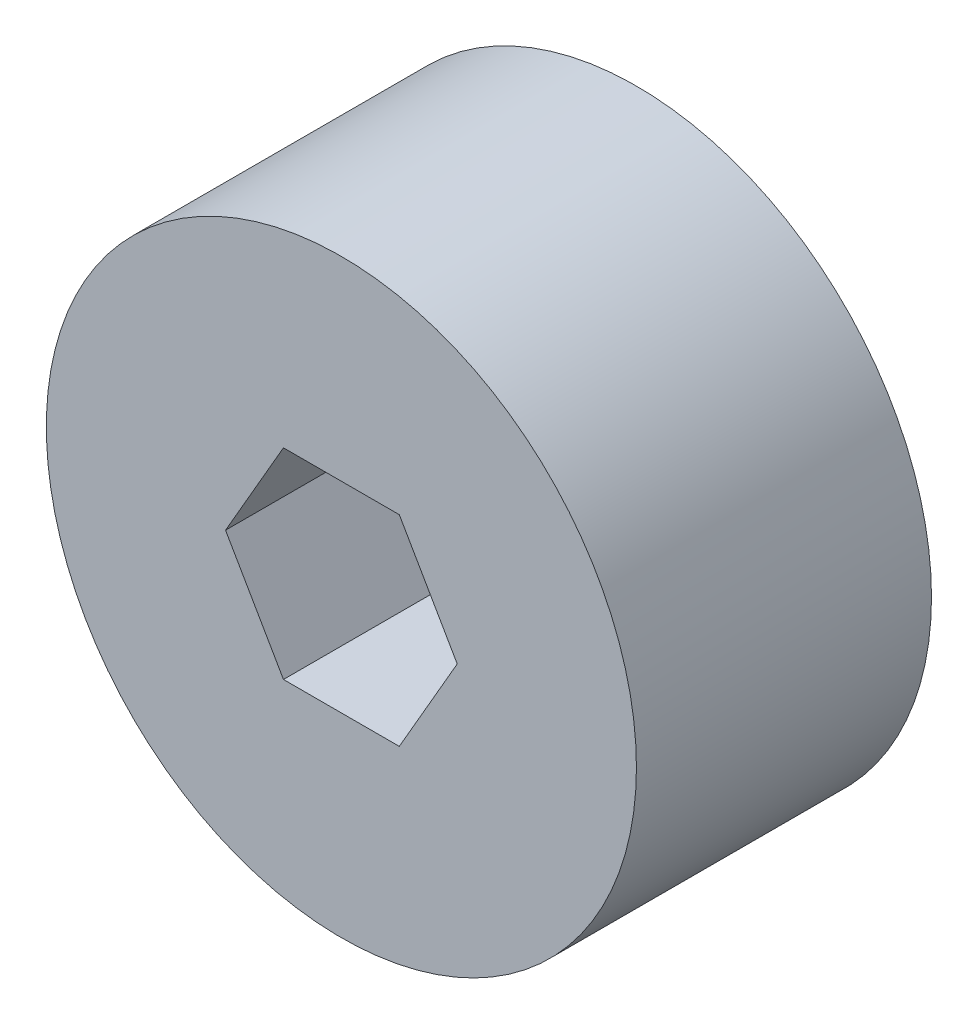
ISO-10303-21;
HEADER;
FILE_DESCRIPTION(('STEP AP214'),'2;1');
FILE_NAME('part.step','',(''),(''),'','','');
FILE_SCHEMA(('AUTOMOTIVE_DESIGN { 1 0 10303 214 1 1 1 1 }'));
ENDSEC;
DATA;
#1=APPLICATION_CONTEXT('core data for automotive mechanical design processes');
#2=APPLICATION_PROTOCOL_DEFINITION('international standard','automotive_design',2000,#1);
#3=PRODUCT_CONTEXT('',#1,'mechanical');
#4=PRODUCT('Part','Part','',(#3));
#5=PRODUCT_RELATED_PRODUCT_CATEGORY('part','',(#4));
#6=PRODUCT_DEFINITION_FORMATION('','',#4);
#7=PRODUCT_DEFINITION_CONTEXT('part definition',#1,'design');
#8=PRODUCT_DEFINITION('design','',#6,#7);
#9=PRODUCT_DEFINITION_SHAPE('','',#8);
#10=(LENGTH_UNIT() NAMED_UNIT(*) SI_UNIT(.MILLI.,.METRE.));
#11=(NAMED_UNIT(*) PLANE_ANGLE_UNIT() SI_UNIT($,.RADIAN.));
#12=(NAMED_UNIT(*) SI_UNIT($,.STERADIAN.) SOLID_ANGLE_UNIT());
#13=UNCERTAINTY_MEASURE_WITH_UNIT(LENGTH_MEASURE(1.E-05),#10,'distance_accuracy_value','');
#14=(GEOMETRIC_REPRESENTATION_CONTEXT(3) GLOBAL_UNCERTAINTY_ASSIGNED_CONTEXT((#13)) GLOBAL_UNIT_ASSIGNED_CONTEXT((#10,
#11,#12)) REPRESENTATION_CONTEXT('',''));
#15=CARTESIAN_POINT('',(0.,0.,0.));
#16=DIRECTION('',(0.,0.,1.));
#17=DIRECTION('',(1.,0.,0.));
#18=AXIS2_PLACEMENT_3D('',#15,#16,#17);
#19=CARTESIAN_POINT('',(0.,0.,12.7));
#20=DIRECTION('',(0.,0.,-1.));
#21=DIRECTION('',(-1.,0.,0.));
#22=AXIS2_PLACEMENT_3D('',#19,#20,#21);
#23=CYLINDRICAL_SURFACE('',#22,12.7);
#24=CARTESIAN_POINT('',(0.,0.,12.7));
#25=DIRECTION('',(0.,0.,1.));
#26=DIRECTION('',(1.,0.,0.));
#27=AXIS2_PLACEMENT_3D('',#24,#25,#26);
#28=CIRCLE('',#27,12.7);
#29=CARTESIAN_POINT('',(12.7,0.,12.7));
#30=VERTEX_POINT('',#29);
#31=EDGE_CURVE('E11',#30,#30,#28,.T.);
#32=ORIENTED_EDGE('',*,*,#31,.F.);
#33=EDGE_LOOP('',(#32));
#34=FACE_BOUND('',#33,.T.);
#35=CARTESIAN_POINT('',(0.,0.,0.));
#36=DIRECTION('',(0.,0.,1.));
#37=DIRECTION('',(1.,0.,0.));
#38=AXIS2_PLACEMENT_3D('',#35,#36,#37);
#39=CIRCLE('',#38,12.7);
#40=CARTESIAN_POINT('',(12.7,0.,0.));
#41=VERTEX_POINT('',#40);
#42=EDGE_CURVE('E48',#41,#41,#39,.T.);
#43=ORIENTED_EDGE('',*,*,#42,.T.);
#44=EDGE_LOOP('',(#43));
#45=FACE_BOUND('',#44,.T.);
#46=ADVANCED_FACE('F45',(#34,#45),#23,.T.);
#47=CARTESIAN_POINT('',(0.,0.,12.7));
#48=DIRECTION('',(0.,0.,1.));
#49=DIRECTION('',(1.,0.,0.));
#50=AXIS2_PLACEMENT_3D('',#47,#48,#49);
#51=PLANE('',#50);
#52=DIRECTION('',(0.5,-0.866025403784438,0.));
#53=VECTOR('',#52,1.);
#54=CARTESIAN_POINT('',(-4.98599692472161,0.,12.7));
#55=LINE('',#54,#53);
#56=CARTESIAN_POINT('',(-4.98599692472161,0.,12.7));
#57=VERTEX_POINT('',#56);
#58=CARTESIAN_POINT('',(-2.4929984623608,-4.318,12.7));
#59=VERTEX_POINT('',#58);
#60=EDGE_CURVE('E60',#57,#59,#55,.T.);
#61=ORIENTED_EDGE('',*,*,#60,.F.);
#62=DIRECTION('',(-0.5,-0.866025403784439,0.));
#63=VECTOR('',#62,1.);
#64=CARTESIAN_POINT('',(-2.4929984623608,4.318,12.7));
#65=LINE('',#64,#63);
#66=CARTESIAN_POINT('',(-2.4929984623608,4.318,12.7));
#67=VERTEX_POINT('',#66);
#68=EDGE_CURVE('E120',#67,#57,#65,.T.);
#69=ORIENTED_EDGE('',*,*,#68,.F.);
#70=DIRECTION('',(-1.,0.,0.));
#71=VECTOR('',#70,1.);
#72=CARTESIAN_POINT('',(2.4929984623608,4.318,12.7));
#73=LINE('',#72,#71);
#74=CARTESIAN_POINT('',(2.4929984623608,4.318,12.7));
#75=VERTEX_POINT('',#74);
#76=EDGE_CURVE('E124',#75,#67,#73,.T.);
#77=ORIENTED_EDGE('',*,*,#76,.F.);
#78=DIRECTION('',(-0.5,0.866025403784439,0.));
#79=VECTOR('',#78,1.);
#80=CARTESIAN_POINT('',(4.98599692472161,0.,12.7));
#81=LINE('',#80,#79);
#82=CARTESIAN_POINT('',(4.98599692472161,0.,12.7));
#83=VERTEX_POINT('',#82);
#84=EDGE_CURVE('E147',#83,#75,#81,.T.);
#85=ORIENTED_EDGE('',*,*,#84,.F.);
#86=DIRECTION('',(0.5,0.866025403784438,0.));
#87=VECTOR('',#86,1.);
#88=CARTESIAN_POINT('',(2.4929984623608,-4.318,12.7));
#89=LINE('',#88,#87);
#90=CARTESIAN_POINT('',(2.4929984623608,-4.318,12.7));
#91=VERTEX_POINT('',#90);
#92=EDGE_CURVE('E143',#91,#83,#89,.T.);
#93=ORIENTED_EDGE('',*,*,#92,.F.);
#94=DIRECTION('',(1.,0.,0.));
#95=VECTOR('',#94,1.);
#96=CARTESIAN_POINT('',(-2.4929984623608,-4.318,12.7));
#97=LINE('',#96,#95);
#98=EDGE_CURVE('E140',#59,#91,#97,.T.);
#99=ORIENTED_EDGE('',*,*,#98,.F.);
#100=EDGE_LOOP('',(#61,#69,#77,#85,#93,#99));
#101=FACE_BOUND('',#100,.T.);
#102=ORIENTED_EDGE('',*,*,#31,.T.);
#103=EDGE_LOOP('',(#102));
#104=FACE_BOUND('',#103,.T.);
#105=ADVANCED_FACE('F171',(#101,#104),#51,.T.);
#106=CARTESIAN_POINT('',(0.,0.,0.));
#107=DIRECTION('',(0.,0.,1.));
#108=DIRECTION('',(1.,0.,0.));
#109=AXIS2_PLACEMENT_3D('',#106,#107,#108);
#110=PLANE('',#109);
#111=DIRECTION('',(-0.5,-0.866025403784439,0.));
#112=VECTOR('',#111,1.);
#113=CARTESIAN_POINT('',(-2.4929984623608,4.318,0.));
#114=LINE('',#113,#112);
#115=CARTESIAN_POINT('',(-2.4929984623608,4.318,0.));
#116=VERTEX_POINT('',#115);
#117=CARTESIAN_POINT('',(-4.98599692472161,0.,0.));
#118=VERTEX_POINT('',#117);
#119=EDGE_CURVE('E107',#116,#118,#114,.T.);
#120=ORIENTED_EDGE('',*,*,#119,.T.);
#121=DIRECTION('',(0.5,-0.866025403784438,0.));
#122=VECTOR('',#121,1.);
#123=CARTESIAN_POINT('',(-4.98599692472161,0.,0.));
#124=LINE('',#123,#122);
#125=CARTESIAN_POINT('',(-2.4929984623608,-4.318,0.));
#126=VERTEX_POINT('',#125);
#127=EDGE_CURVE('E100',#118,#126,#124,.T.);
#128=ORIENTED_EDGE('',*,*,#127,.T.);
#129=DIRECTION('',(1.,0.,0.));
#130=VECTOR('',#129,1.);
#131=CARTESIAN_POINT('',(-2.4929984623608,-4.318,0.));
#132=LINE('',#131,#130);
#133=CARTESIAN_POINT('',(2.4929984623608,-4.318,0.));
#134=VERTEX_POINT('',#133);
#135=EDGE_CURVE('E110',#126,#134,#132,.T.);
#136=ORIENTED_EDGE('',*,*,#135,.T.);
#137=DIRECTION('',(0.5,0.866025403784438,0.));
#138=VECTOR('',#137,1.);
#139=CARTESIAN_POINT('',(2.4929984623608,-4.318,0.));
#140=LINE('',#139,#138);
#141=CARTESIAN_POINT('',(4.98599692472161,0.,0.));
#142=VERTEX_POINT('',#141);
#143=EDGE_CURVE('E68',#134,#142,#140,.T.);
#144=ORIENTED_EDGE('',*,*,#143,.T.);
#145=DIRECTION('',(-0.5,0.866025403784439,0.));
#146=VECTOR('',#145,1.);
#147=CARTESIAN_POINT('',(4.98599692472161,0.,0.));
#148=LINE('',#147,#146);
#149=CARTESIAN_POINT('',(2.4929984623608,4.318,0.));
#150=VERTEX_POINT('',#149);
#151=EDGE_CURVE('E129',#142,#150,#148,.T.);
#152=ORIENTED_EDGE('',*,*,#151,.T.);
#153=DIRECTION('',(-1.,0.,0.));
#154=VECTOR('',#153,1.);
#155=CARTESIAN_POINT('',(2.4929984623608,4.318,0.));
#156=LINE('',#155,#154);
#157=EDGE_CURVE('E133',#150,#116,#156,.T.);
#158=ORIENTED_EDGE('',*,*,#157,.T.);
#159=EDGE_LOOP('',(#120,#128,#136,#144,#152,#158));
#160=FACE_BOUND('',#159,.T.);
#161=ORIENTED_EDGE('',*,*,#42,.F.);
#162=EDGE_LOOP('',(#161));
#163=FACE_BOUND('',#162,.T.);
#164=ADVANCED_FACE('F115',(#160,#163),#110,.F.);
#165=CARTESIAN_POINT('',(-4.98599692472161,0.,0.));
#166=DIRECTION('',(-0.866025403784438,-0.5,0.));
#167=DIRECTION('',(0.5,-0.866025403784438,0.));
#168=AXIS2_PLACEMENT_3D('',#165,#166,#167);
#169=PLANE('',#168);
#170=ORIENTED_EDGE('',*,*,#60,.T.);
#171=DIRECTION('',(0.,0.,1.));
#172=VECTOR('',#171,1.);
#173=CARTESIAN_POINT('',(-2.4929984623608,-4.318,0.));
#174=LINE('',#173,#172);
#175=EDGE_CURVE('E96',#126,#59,#174,.T.);
#176=ORIENTED_EDGE('',*,*,#175,.F.);
#177=ORIENTED_EDGE('',*,*,#127,.F.);
#178=DIRECTION('',(0.,0.,1.));
#179=VECTOR('',#178,1.);
#180=CARTESIAN_POINT('',(-4.98599692472161,0.,0.));
#181=LINE('',#180,#179);
#182=EDGE_CURVE('E154',#118,#57,#181,.T.);
#183=ORIENTED_EDGE('',*,*,#182,.T.);
#184=EDGE_LOOP('',(#170,#176,#177,#183));
#185=FACE_BOUND('',#184,.T.);
#186=ADVANCED_FACE('F98',(#185),#169,.F.);
#187=CARTESIAN_POINT('',(-2.4929984623608,4.318,0.));
#188=DIRECTION('',(-0.866025403784439,0.5,0.));
#189=DIRECTION('',(-0.5,-0.866025403784439,0.));
#190=AXIS2_PLACEMENT_3D('',#187,#188,#189);
#191=PLANE('',#190);
#192=ORIENTED_EDGE('',*,*,#68,.T.);
#193=ORIENTED_EDGE('',*,*,#182,.F.);
#194=ORIENTED_EDGE('',*,*,#119,.F.);
#195=DIRECTION('',(0.,0.,1.));
#196=VECTOR('',#195,1.);
#197=CARTESIAN_POINT('',(-2.4929984623608,4.318,0.));
#198=LINE('',#197,#196);
#199=EDGE_CURVE('E157',#116,#67,#198,.T.);
#200=ORIENTED_EDGE('',*,*,#199,.T.);
#201=EDGE_LOOP('',(#192,#193,#194,#200));
#202=FACE_BOUND('',#201,.T.);
#203=ADVANCED_FACE('F182',(#202),#191,.F.);
#204=CARTESIAN_POINT('',(2.4929984623608,4.318,0.));
#205=DIRECTION('',(0.,1.,0.));
#206=DIRECTION('',(0.,0.,1.));
#207=AXIS2_PLACEMENT_3D('',#204,#205,#206);
#208=PLANE('',#207);
#209=ORIENTED_EDGE('',*,*,#76,.T.);
#210=ORIENTED_EDGE('',*,*,#199,.F.);
#211=ORIENTED_EDGE('',*,*,#157,.F.);
#212=DIRECTION('',(0.,0.,1.));
#213=VECTOR('',#212,1.);
#214=CARTESIAN_POINT('',(2.4929984623608,4.318,0.));
#215=LINE('',#214,#213);
#216=EDGE_CURVE('E160',#150,#75,#215,.T.);
#217=ORIENTED_EDGE('',*,*,#216,.T.);
#218=EDGE_LOOP('',(#209,#210,#211,#217));
#219=FACE_BOUND('',#218,.T.);
#220=ADVANCED_FACE('F180',(#219),#208,.F.);
#221=CARTESIAN_POINT('',(4.98599692472161,0.,0.));
#222=DIRECTION('',(0.866025403784439,0.5,0.));
#223=DIRECTION('',(-0.5,0.866025403784439,0.));
#224=AXIS2_PLACEMENT_3D('',#221,#222,#223);
#225=PLANE('',#224);
#226=ORIENTED_EDGE('',*,*,#84,.T.);
#227=ORIENTED_EDGE('',*,*,#216,.F.);
#228=ORIENTED_EDGE('',*,*,#151,.F.);
#229=DIRECTION('',(0.,0.,1.));
#230=VECTOR('',#229,1.);
#231=CARTESIAN_POINT('',(4.98599692472161,0.,0.));
#232=LINE('',#231,#230);
#233=EDGE_CURVE('E163',#142,#83,#232,.T.);
#234=ORIENTED_EDGE('',*,*,#233,.T.);
#235=EDGE_LOOP('',(#226,#227,#228,#234));
#236=FACE_BOUND('',#235,.T.);
#237=ADVANCED_FACE('F176',(#236),#225,.F.);
#238=CARTESIAN_POINT('',(2.4929984623608,-4.318,0.));
#239=DIRECTION('',(0.866025403784438,-0.5,0.));
#240=DIRECTION('',(0.5,0.866025403784438,0.));
#241=AXIS2_PLACEMENT_3D('',#238,#239,#240);
#242=PLANE('',#241);
#243=ORIENTED_EDGE('',*,*,#92,.T.);
#244=ORIENTED_EDGE('',*,*,#233,.F.);
#245=ORIENTED_EDGE('',*,*,#143,.F.);
#246=DIRECTION('',(0.,0.,1.));
#247=VECTOR('',#246,1.);
#248=CARTESIAN_POINT('',(2.4929984623608,-4.318,0.));
#249=LINE('',#248,#247);
#250=EDGE_CURVE('E106',#134,#91,#249,.T.);
#251=ORIENTED_EDGE('',*,*,#250,.T.);
#252=EDGE_LOOP('',(#243,#244,#245,#251));
#253=FACE_BOUND('',#252,.T.);
#254=ADVANCED_FACE('F167',(#253),#242,.F.);
#255=CARTESIAN_POINT('',(-2.4929984623608,-4.318,0.));
#256=DIRECTION('',(0.,-1.,0.));
#257=DIRECTION('',(0.,0.,-1.));
#258=AXIS2_PLACEMENT_3D('',#255,#256,#257);
#259=PLANE('',#258);
#260=ORIENTED_EDGE('',*,*,#98,.T.);
#261=ORIENTED_EDGE('',*,*,#250,.F.);
#262=ORIENTED_EDGE('',*,*,#135,.F.);
#263=ORIENTED_EDGE('',*,*,#175,.T.);
#264=EDGE_LOOP('',(#260,#261,#262,#263));
#265=FACE_BOUND('',#264,.T.);
#266=ADVANCED_FACE('F111',(#265),#259,.F.);
#267=CLOSED_SHELL('',(#46,#105,#164,#186,#203,#220,#237,#254,#266));
#268=MANIFOLD_SOLID_BREP('B2',#267);
#269=ADVANCED_BREP_SHAPE_REPRESENTATION('',(#18,#268),#14);
#270=SHAPE_DEFINITION_REPRESENTATION(#9,#269);
ENDSEC;
END-ISO-10303-21;
